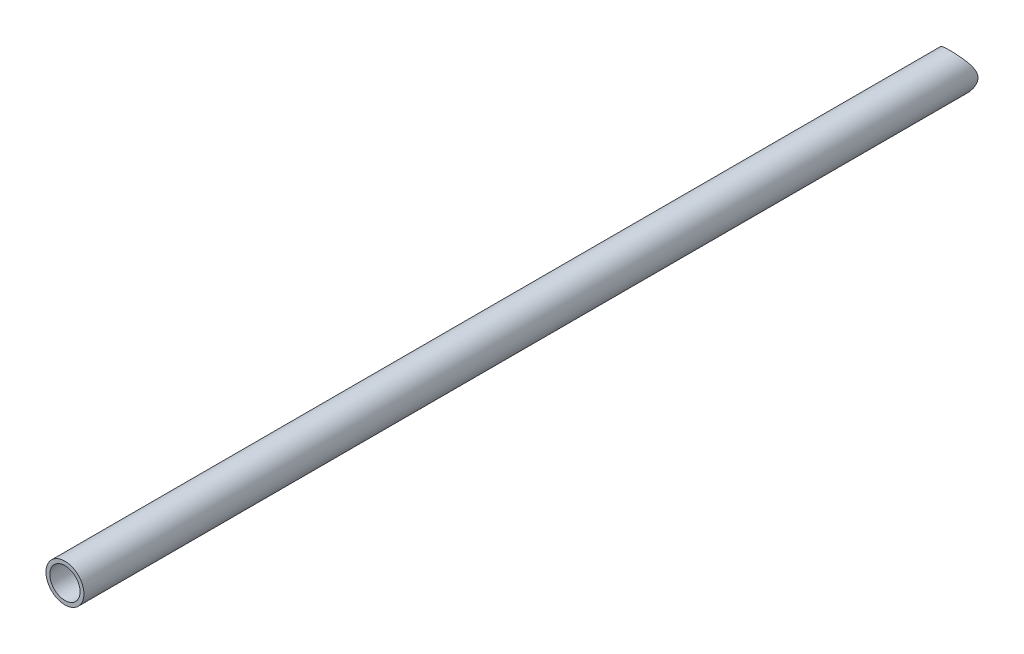
ISO-10303-21;
HEADER;
FILE_DESCRIPTION(('STEP AP214'),'2;1');
FILE_NAME('part.step','',(''),(''),'','','');
FILE_SCHEMA(('AUTOMOTIVE_DESIGN { 1 0 10303 214 1 1 1 1 }'));
ENDSEC;
DATA;
#1=APPLICATION_CONTEXT('core data for automotive mechanical design processes');
#2=APPLICATION_PROTOCOL_DEFINITION('international standard','automotive_design',2000,#1);
#3=PRODUCT_CONTEXT('',#1,'mechanical');
#4=PRODUCT('Part','Part','',(#3));
#5=PRODUCT_RELATED_PRODUCT_CATEGORY('part','',(#4));
#6=PRODUCT_DEFINITION_FORMATION('','',#4);
#7=PRODUCT_DEFINITION_CONTEXT('part definition',#1,'design');
#8=PRODUCT_DEFINITION('design','',#6,#7);
#9=PRODUCT_DEFINITION_SHAPE('','',#8);
#10=(LENGTH_UNIT() NAMED_UNIT(*) SI_UNIT(.MILLI.,.METRE.));
#11=(NAMED_UNIT(*) PLANE_ANGLE_UNIT() SI_UNIT($,.RADIAN.));
#12=(NAMED_UNIT(*) SI_UNIT($,.STERADIAN.) SOLID_ANGLE_UNIT());
#13=UNCERTAINTY_MEASURE_WITH_UNIT(LENGTH_MEASURE(1.E-05),#10,'distance_accuracy_value','');
#14=(GEOMETRIC_REPRESENTATION_CONTEXT(3) GLOBAL_UNCERTAINTY_ASSIGNED_CONTEXT((#13)) GLOBAL_UNIT_ASSIGNED_CONTEXT((#10,
#11,#12)) REPRESENTATION_CONTEXT('',''));
#15=CARTESIAN_POINT('',(0.,0.,0.));
#16=DIRECTION('',(0.,0.,1.));
#17=DIRECTION('',(1.,0.,0.));
#18=AXIS2_PLACEMENT_3D('',#15,#16,#17);
#19=CARTESIAN_POINT('',(0.,15.24,0.));
#20=DIRECTION('',(0.,-1.,0.));
#21=DIRECTION('',(0.,0.,-1.));
#22=AXIS2_PLACEMENT_3D('',#19,#20,#21);
#23=CYLINDRICAL_SURFACE('',#22,21.082);
#24=CARTESIAN_POINT('',(16.7005,0.,12.8663912481317));
#25=CARTESIAN_POINT('',(16.700501651617,-0.318048689825933,12.8663873917433));
#26=CARTESIAN_POINT('',(16.6913959959469,-0.636078058233101,12.878233728294));
#27=CARTESIAN_POINT('',(16.6552091317132,-1.26936872938503,12.9249990641684));
#28=CARTESIAN_POINT('',(16.6281288319816,-1.58463017126487,12.9599168969529));
#29=CARTESIAN_POINT('',(16.556552223082,-2.21059640241425,13.0512314661233));
#30=CARTESIAN_POINT('',(16.5120227972951,-2.52129135473047,13.1076690392102));
#31=CARTESIAN_POINT('',(16.406435560555,-3.13573086215765,13.2395887943427));
#32=CARTESIAN_POINT('',(16.3453749130287,-3.43947421474206,13.3150742446402));
#33=CARTESIAN_POINT('',(16.1842492768174,-4.14084876098796,13.5108048361985));
#34=CARTESIAN_POINT('',(16.077982364405,-4.53524728481028,13.6375397082877));
#35=CARTESIAN_POINT('',(15.8396836474816,-5.30799392340751,13.9136035044063));
#36=CARTESIAN_POINT('',(15.7076417804045,-5.68633569915751,14.0629412474859));
#37=CARTESIAN_POINT('',(15.4192499567052,-6.42743384951334,14.3785690320073));
#38=CARTESIAN_POINT('',(15.2628423194377,-6.79015056507849,14.5448989685858));
#39=CARTESIAN_POINT('',(14.9272840463478,-7.49911362250995,14.8890808174978));
#40=CARTESIAN_POINT('',(14.7481336137038,-7.84536011147893,15.066932626891));
#41=CARTESIAN_POINT('',(14.3024041651075,-8.63829840289962,15.4924732494015));
#42=CARTESIAN_POINT('',(14.0269775406112,-9.07846296782939,15.743098898961));
#43=CARTESIAN_POINT('',(13.4378225813671,-9.92973408775898,16.2488946386916));
#44=CARTESIAN_POINT('',(13.1240811814276,-10.3408306548058,16.5040662535432));
#45=CARTESIAN_POINT('',(12.4592472119749,-11.1328767461881,17.01154509946));
#46=CARTESIAN_POINT('',(12.1081844373139,-11.5138499015276,17.2638544400926));
#47=CARTESIAN_POINT('',(11.3689722747507,-12.2443047785302,17.7593665534507));
#48=CARTESIAN_POINT('',(10.9808349094774,-12.5937966380637,18.0025722429587));
#49=CARTESIAN_POINT('',(10.246856978174,-13.1942295023333,18.4281327972869));
#50=CARTESIAN_POINT('',(9.90742040228808,-13.4511353391158,18.6131389279361));
#51=CARTESIAN_POINT('',(9.2052426848626,-13.9410699521921,18.9702218281539));
#52=CARTESIAN_POINT('',(8.84250262469103,-14.1740998351184,19.1422991968622));
#53=CARTESIAN_POINT('',(8.09505502437904,-14.6138480285565,19.4701604131554));
#54=CARTESIAN_POINT('',(7.7103755682354,-14.8205989295075,19.6259643988977));
#55=CARTESIAN_POINT('',(6.92003928515724,-15.2056855933979,19.9183633517524));
#56=CARTESIAN_POINT('',(6.51438587820195,-15.3840259696791,20.0549614371226));
#57=CARTESIAN_POINT('',(5.75026126756025,-15.683807125484,20.2859119874366));
#58=CARTESIAN_POINT('',(5.39455250044627,-15.8097863364325,20.3835280358246));
#59=CARTESIAN_POINT('',(4.67143177476956,-16.0383338840936,20.5612989461302));
#60=CARTESIAN_POINT('',(4.30402100750051,-16.1409045952257,20.6414555789898));
#61=CARTESIAN_POINT('',(3.55969655452295,-16.3212078930991,20.7827504146704));
#62=CARTESIAN_POINT('',(3.18278649496967,-16.3989498072969,20.8438957592501));
#63=CARTESIAN_POINT('',(2.4218032502431,-16.5284760682203,20.9459531252307));
#64=CARTESIAN_POINT('',(2.0377299788854,-16.5802601024235,20.9868649030276));
#65=CARTESIAN_POINT('',(1.26394853613976,-16.6571543818868,21.0476663371774));
#66=CARTESIAN_POINT('',(0.874225795711741,-16.6821746677361,21.0674850936837));
#67=CARTESIAN_POINT('',(0.0934815880961315,-16.7048039829193,21.0854085011731));
#68=CARTESIAN_POINT('',(-0.297539881527446,-16.7024129608096,21.0835131114047));
#69=CARTESIAN_POINT('',(-1.07775822907055,-16.670260832553,21.0580513010129));
#70=CARTESIAN_POINT('',(-1.46695501820661,-16.6404984082069,21.0344838366684));
#71=CARTESIAN_POINT('',(-2.24046061871697,-16.5541076339679,20.9662062207014));
#72=CARTESIAN_POINT('',(-2.62476953138165,-16.4974798417346,20.9214965079407));
#73=CARTESIAN_POINT('',(-3.36595716497834,-16.3618931457417,20.8147525142177));
#74=CARTESIAN_POINT('',(-3.72322478696742,-16.2842447345686,20.7537370105179));
#75=CARTESIAN_POINT('',(-4.42876565574087,-16.1066776484362,20.6147044373035));
#76=CARTESIAN_POINT('',(-4.77703928705759,-16.006759927352,20.5366880959994));
#77=CARTESIAN_POINT('',(-5.46288298696909,-15.7858617455712,20.3649853151274));
#78=CARTESIAN_POINT('',(-5.80045212790357,-15.6648794652666,20.2712975218488));
#79=CARTESIAN_POINT('',(-6.46349157949888,-15.4031504972252,20.0697309820339));
#80=CARTESIAN_POINT('',(-6.78896023061739,-15.2624011110486,19.9618502981304));
#81=CARTESIAN_POINT('',(-7.45803660736237,-14.9477144408192,19.7222407688445));
#82=CARTESIAN_POINT('',(-7.80028273182769,-14.771874867815,19.5892101053885));
#83=CARTESIAN_POINT('',(-8.46779474930284,-14.3996258832921,19.3100514694989));
#84=CARTESIAN_POINT('',(-8.79305971576124,-14.2032153511039,19.1639227835708));
#85=CARTESIAN_POINT('',(-9.42603574881757,-13.791272704257,18.8606410730861));
#86=CARTESIAN_POINT('',(-9.73373976511962,-13.5757329972033,18.7034836764455));
#87=CARTESIAN_POINT('',(-10.3310355839786,-13.1269183916845,18.3803090933934));
#88=CARTESIAN_POINT('',(-10.6206253345675,-12.8936414905733,18.2142909071728));
#89=CARTESIAN_POINT('',(-11.2389465364587,-12.360896534547,17.8407575035741));
#90=CARTESIAN_POINT('',(-11.5635215076674,-12.0576666498107,17.631715822124));
#91=CARTESIAN_POINT('',(-12.1856888122493,-11.4285380286701,17.2075996876857));
#92=CARTESIAN_POINT('',(-12.483276565549,-11.1026354609468,16.9925242187667));
#93=CARTESIAN_POINT('',(-13.0514882835474,-10.4287970356688,16.5601013148656));
#94=CARTESIAN_POINT('',(-13.3220829665062,-10.0808379062256,16.3427516892293));
#95=CARTESIAN_POINT('',(-13.8355433882297,-9.36370199013698,15.9104067113895));
#96=CARTESIAN_POINT('',(-14.0784128552644,-8.99452806635241,15.6954110461675));
#97=CARTESIAN_POINT('',(-14.5090787381799,-8.27929045136326,15.2974838615841));
#98=CARTESIAN_POINT('',(-14.6999945759619,-7.93555716771786,15.1137383531768));
#99=CARTESIAN_POINT('',(-15.0589359152759,-7.23127694571284,14.7561286042124));
#100=CARTESIAN_POINT('',(-15.2269593605258,-6.87072850085055,14.5822652521248));
#101=CARTESIAN_POINT('',(-15.5386367295555,-6.13330543738905,14.2496787227652));
#102=CARTESIAN_POINT('',(-15.6823324945151,-5.75646027869631,14.0909297604156));
#103=CARTESIAN_POINT('',(-15.944006998122,-4.9860464783198,13.7941477236687));
#104=CARTESIAN_POINT('',(-16.0619965058618,-4.59248492250696,13.6561059819979));
#105=CARTESIAN_POINT('',(-16.2405793140075,-3.90364687412951,13.4427608518797));
#106=CARTESIAN_POINT('',(-16.307957215658,-3.61219218652713,13.3607726231799));
#107=CARTESIAN_POINT('',(-16.4275469470861,-3.02208006034199,13.2134566832712));
#108=CARTESIAN_POINT('',(-16.4797635271719,-2.72342490962226,13.1481237544489));
#109=CARTESIAN_POINT('',(-16.5680987875878,-2.12070532915108,13.0366369347095));
#110=CARTESIAN_POINT('',(-16.604244860437,-1.81665102975389,12.9904504174862));
#111=CARTESIAN_POINT('',(-16.6598377177618,-1.20454264699297,12.9190788389297));
#112=CARTESIAN_POINT('',(-16.6792847988268,-0.896488634766445,12.8938934045981));
#113=CARTESIAN_POINT('',(-16.7010868754288,-0.277219204190502,12.8656423640751));
#114=CARTESIAN_POINT('',(-16.7033569139518,0.0340043141999877,12.862686705965));
#115=CARTESIAN_POINT('',(-16.6905260764593,0.655473620640899,12.8793309880759));
#116=CARTESIAN_POINT('',(-16.6754253802914,0.965719418780784,12.8989306947701));
#117=CARTESIAN_POINT('',(-16.6281800817812,1.5831360912126,12.9597769137203));
#118=CARTESIAN_POINT('',(-16.596014116721,1.89030261864608,13.0010505572745));
#119=CARTESIAN_POINT('',(-16.515310333516,2.49911581309073,13.1034143704594));
#120=CARTESIAN_POINT('',(-16.4667700170888,2.8007616303827,13.1645075639618));
#121=CARTESIAN_POINT('',(-16.3387002130721,3.47895656814934,13.3233127026583));
#122=CARTESIAN_POINT('',(-16.2543206410225,3.85331486677387,13.4264738735132));
#123=CARTESIAN_POINT('',(-16.0622126684386,4.5887509913602,13.6557079223735));
#124=CARTESIAN_POINT('',(-15.9544766542316,4.94982444176101,13.7817882693433));
#125=CARTESIAN_POINT('',(-15.7170466761651,5.65872926612365,14.0519593402889));
#126=CARTESIAN_POINT('',(-15.5873007902475,6.00652688857553,14.1960924359324));
#127=CARTESIAN_POINT('',(-15.3073659836329,6.68781696743424,14.4975037303306));
#128=CARTESIAN_POINT('',(-15.1571762718318,7.02130886960294,14.6547824376832));
#129=CARTESIAN_POINT('',(-14.7692272097316,7.81315039908071,15.0474488039445));
#130=CARTESIAN_POINT('',(-14.5214022213876,8.26423493376886,15.2875918215807));
#131=CARTESIAN_POINT('',(-13.9879350069465,9.1381928231956,15.7771886692278));
#132=CARTESIAN_POINT('',(-13.7022784892393,9.56105542529523,16.0266459922018));
#133=CARTESIAN_POINT('',(-13.0938498051449,10.3787116126544,16.5274690255778));
#134=CARTESIAN_POINT('',(-12.7710445709027,10.7734796758603,16.7788362472858));
#135=CARTESIAN_POINT('',(-12.0890683367024,11.5335054910505,17.2766725909176));
#136=CARTESIAN_POINT('',(-11.7299026813521,11.8987675659614,17.523142426354));
#137=CARTESIAN_POINT('',(-10.9715181600409,12.601687953773,18.0078075980411));
#138=CARTESIAN_POINT('',(-10.5719158223075,12.9390134279921,18.2458878375064));
#139=CARTESIAN_POINT('',(-9.73647589874634,13.5788301252783,18.7050542579474));
#140=CARTESIAN_POINT('',(-9.3006328827464,13.8813161118687,18.9261378826259));
#141=CARTESIAN_POINT('',(-8.39513210989653,14.4468801952228,19.344775363046));
#142=CARTESIAN_POINT('',(-7.9255716356719,14.7100654137341,19.542392867089));
#143=CARTESIAN_POINT('',(-7.19731935840765,15.0724532868862,19.8170813368229));
#144=CARTESIAN_POINT('',(-6.95062350463153,15.1878355139333,19.9050092277108));
#145=CARTESIAN_POINT('',(-6.44953596791651,15.4073034317559,20.0729674857473));
#146=CARTESIAN_POINT('',(-6.19514252203694,15.5113865093176,20.1529960255847));
#147=CARTESIAN_POINT('',(-5.58850270960066,15.742123762028,20.3310441859218));
#148=CARTESIAN_POINT('',(-5.23330546142895,15.8638435230263,20.4254935692793));
#149=CARTESIAN_POINT('',(-4.51172820359067,16.0839438789019,20.5969053717735));
#150=CARTESIAN_POINT('',(-4.14535110562109,16.1823304931231,20.6738723007111));
#151=CARTESIAN_POINT('',(-3.40359803049756,16.3544205439274,20.8088501637051));
#152=CARTESIAN_POINT('',(-3.02822692471347,16.4281370324666,20.8668711209056));
#153=CARTESIAN_POINT('',(-2.27076954163596,16.5498471001216,20.9628256560164));
#154=CARTESIAN_POINT('',(-1.88868301177858,16.5978397096271,21.0007584767437));
#155=CARTESIAN_POINT('',(-1.11938289881167,16.6674326009731,21.0558038754408));
#156=CARTESIAN_POINT('',(-0.732156901736672,16.6889487293993,21.0728500661707));
#157=CARTESIAN_POINT('',(0.043204504981922,16.7049451075738,21.0855208771548));
#158=CARTESIAN_POINT('',(0.431339910592508,16.6994254769932,21.0811455922291));
#159=CARTESIAN_POINT('',(1.20549610108005,16.6614433499555,21.0510708685619));
#160=CARTESIAN_POINT('',(1.59151663713242,16.628977748906,21.0253689726652));
#161=CARTESIAN_POINT('',(2.35843983195101,16.5376416882991,20.953205799383));
#162=CARTESIAN_POINT('',(2.7393425623507,16.4787715987203,20.906744812873));
#163=CARTESIAN_POINT('',(3.47653064006858,16.3387543610254,20.796565615652));
#164=CARTESIAN_POINT('',(3.83315703418039,16.258715546456,20.7337076877095));
#165=CARTESIAN_POINT('',(4.53720988902331,16.0764627980447,20.5911014899583));
#166=CARTESIAN_POINT('',(4.88463669251061,15.9742496916755,20.5113538504213));
#167=CARTESIAN_POINT('',(5.56861372568991,15.748870531723,20.3363199108091));
#168=CARTESIAN_POINT('',(5.90516299606031,15.625702636043,20.2410322446695));
#169=CARTESIAN_POINT('',(6.56602190545001,15.3597189063707,20.0364111096677));
#170=CARTESIAN_POINT('',(6.89032985410818,15.2169003714472,19.9270757101167));
#171=CARTESIAN_POINT('',(7.55805330288437,14.8974204202017,19.6841387193259));
#172=CARTESIAN_POINT('',(7.90004062352913,14.7187926095879,19.5491993753862));
#173=CARTESIAN_POINT('',(8.56681616378846,14.340963558524,19.2663326131071));
#174=CARTESIAN_POINT('',(8.89160340183399,14.1417611458385,19.1184044548038));
#175=CARTESIAN_POINT('',(9.52343973795521,13.7242214709157,18.811650675443));
#176=CARTESIAN_POINT('',(9.83048093371337,13.505875791456,18.6528202674384));
#177=CARTESIAN_POINT('',(10.4262683905535,13.0514378494232,18.3264577517432));
#178=CARTESIAN_POINT('',(10.7150125873043,12.8153435909403,18.1589246660528));
#179=CARTESIAN_POINT('',(11.3317154951496,12.2759791897521,17.7819885897027));
#180=CARTESIAN_POINT('',(11.655444297994,11.9689105074742,17.571088575294));
#181=CARTESIAN_POINT('',(12.2756087170259,11.3319800895008,17.1435711177535));
#182=CARTESIAN_POINT('',(12.5720396115871,11.0021144278967,16.9269526938337));
#183=CARTESIAN_POINT('',(13.1375681650508,10.3202416604379,16.4918887587687));
#184=CARTESIAN_POINT('',(13.4066407690612,9.96821472836109,16.2734417676381));
#185=CARTESIAN_POINT('',(13.9167145117196,9.24274717376761,15.8394396391555));
#186=CARTESIAN_POINT('',(14.1577195765203,8.86930955715948,15.6238841010818));
#187=CARTESIAN_POINT('',(14.5805077214523,8.15257906502349,15.2292990917825));
#188=CARTESIAN_POINT('',(14.7658974121463,7.81197346508016,15.0492520992012));
#189=CARTESIAN_POINT('',(15.1143396634912,7.11445388079238,14.6992659871256));
#190=CARTESIAN_POINT('',(15.2773913017285,6.75753922380284,14.5293272852008));
#191=CARTESIAN_POINT('',(15.5798166584451,6.027589569912,14.2045484195266));
#192=CARTESIAN_POINT('',(15.7192178426184,5.65457391200252,14.0496908321221));
#193=CARTESIAN_POINT('',(15.9094287389788,5.0830179858338,13.8329343723868));
#194=CARTESIAN_POINT('',(15.9696792325822,4.89051213912476,13.7632762144976));
#195=CARTESIAN_POINT('',(16.0836734203298,4.5014729928723,13.6298886210665));
#196=CARTESIAN_POINT('',(16.1374148076491,4.30493829418982,13.56616128925));
#197=CARTESIAN_POINT('',(16.2706777095569,3.77960581377658,13.4064365606402));
#198=CARTESIAN_POINT('',(16.3443814845616,3.44750739154091,13.3162382454226));
#199=CARTESIAN_POINT('',(16.4719937124611,2.77441513902288,13.158059006875));
#200=CARTESIAN_POINT('',(16.525909838509,2.43342481185327,13.0900694726647));
#201=CARTESIAN_POINT('',(16.6126379552029,1.74550473979612,12.9798278410167));
#202=CARTESIAN_POINT('',(16.6455042769087,1.39859267761828,12.9375094994427));
#203=CARTESIAN_POINT('',(16.6894329539482,0.701112261556148,12.8807951660989));
#204=CARTESIAN_POINT('',(16.7004981796338,0.3505443951091,12.8663954985354));
#205=CARTESIAN_POINT('',(16.7005,0.,12.8663912481317));
#206=B_SPLINE_CURVE_WITH_KNOTS('',3,(#24,#25,#26,#27,#28,#29,#30,#31,#32,#33,#34,#35,#36,#37,
#38,#39,#40,#41,#42,#43,#44,#45,#46,#47,#48,#49,#50,#51,#52,#53,#54,#55,#56,#57,#58,#59,#60,#61,
#62,#63,#64,#65,#66,#67,#68,#69,#70,#71,#72,#73,#74,#75,#76,#77,#78,#79,#80,#81,#82,#83,#84,#85,
#86,#87,#88,#89,#90,#91,#92,#93,#94,#95,#96,#97,#98,#99,#100,#101,#102,#103,#104,#105,#106,#107,
#108,#109,#110,#111,#112,#113,#114,#115,#116,#117,#118,#119,#120,#121,#122,#123,#124,#125,#126,
#127,#128,#129,#130,#131,#132,#133,#134,#135,#136,#137,#138,#139,#140,#141,#142,#143,#144,#145,
#146,#147,#148,#149,#150,#151,#152,#153,#154,#155,#156,#157,#158,#159,#160,#161,#162,#163,#164,
#165,#166,#167,#168,#169,#170,#171,#172,#173,#174,#175,#176,#177,#178,#179,#180,#181,#182,#183,
#184,#185,#186,#187,#188,#189,#190,#191,#192,#193,#194,#195,#196,#197,#198,#199,#200,#201,#202,
#203,#204,#205),.UNSPECIFIED.,.T.,.F.,(4,2,2,2,2,2,2,2,2,2,2,2,2,2,2,2,2,2,2,2,2,2,2,2,2,2,2,2,
2,2,2,2,2,2,2,2,2,2,2,2,2,2,2,2,2,2,2,2,2,2,2,2,2,2,2,2,2,2,2,2,2,2,2,2,2,2,2,2,2,2,2,2,2,2,2,2,
2,2,2,2,2,2,2,2,2,2,2,2,2,2,4),(0.,0.953770253152086,1.90749228554254,2.86303321846626,
3.81873821557278,5.09973719424736,6.38123727992338,7.66581847596868,8.95038819671196,
10.6778456227999,12.4058937587299,14.1325725533414,15.8586933055416,17.2499206328614,
18.641083448647,20.0305037918119,21.4196982884253,22.5878567174351,23.7558966026555,
24.9234971717229,26.0911117978878,27.2626388435819,28.4341680879188,29.605753755739,
30.7773151053589,31.8881150056962,32.9988673355988,34.109715662636,35.2207157810526,
36.4409200480069,37.6611908241429,38.8819481120533,40.1028434367691,41.5741835920006,
43.0457729868519,44.518941768889,45.9919122167757,47.2929955951988,48.5941957649571,
49.8931347502231,51.1915285216623,52.121264909013,53.0507096785082,53.9785640583686,
54.9064019583445,55.8388259291543,56.7712402462134,57.704824545832,58.6385513495939,
59.8288195609721,61.0194763578914,62.2129820427783,63.4065339252722,65.1080417072819,
66.8101941109068,68.5138735758949,70.2173029801395,71.9387500756245,73.6604555729235,
75.3773790394318,76.2355742662208,77.093967551391,78.2542294880903,79.4141917810572,
80.5735394115764,81.7329307383196,82.8959976596561,84.0590594327964,85.2222552272382,
86.3854347235396,87.4968346849218,88.6081931795964,89.7196494222657,90.831258584705,
92.0563239031349,93.2814590580459,94.507135628079,95.732950237894,97.2121251934925,
98.6915555182791,100.172328736786,101.652894571865,102.934615973831,104.216390286468,
105.496665708338,106.136686065598,106.776932586249,107.831431092887,108.885520258368,
109.936877661342,110.988096632398),.UNSPECIFIED.);
#207=CARTESIAN_POINT('',(16.7005,0.,12.8663912481317));
#208=VERTEX_POINT('',#207);
#209=EDGE_CURVE('E28',#208,#208,#206,.F.);
#210=ORIENTED_EDGE('',*,*,#209,.F.);
#211=EDGE_LOOP('',(#210));
#212=FACE_BOUND('',#211,.T.);
#213=CARTESIAN_POINT('',(13.3223,0.,16.3391262529549));
#214=CARTESIAN_POINT('',(13.3222973717481,0.330253881623365,16.3391305113551));
#215=CARTESIAN_POINT('',(13.3099961281945,0.660550496552831,16.349182095578));
#216=CARTESIAN_POINT('',(13.261020887059,1.31827845434102,16.3889294983763));
#217=CARTESIAN_POINT('',(13.2243335813186,1.64570813372475,16.4186360431746));
#218=CARTESIAN_POINT('',(13.1271643400441,2.29551845533996,16.4964281863531));
#219=CARTESIAN_POINT('',(13.0666301363894,2.61788637815018,16.5445541501573));
#220=CARTESIAN_POINT('',(12.9227855057099,3.25450527586383,16.6571501824458));
#221=CARTESIAN_POINT('',(12.8394771041408,3.56875696987667,16.7216187974362));
#222=CARTESIAN_POINT('',(12.6520943413218,4.18459731586657,16.8638346430613));
#223=CARTESIAN_POINT('',(12.5482159158166,4.48627519913903,16.9414556563588));
#224=CARTESIAN_POINT('',(12.3203000151306,5.07885023591911,17.1079174860316));
#225=CARTESIAN_POINT('',(12.1962532745089,5.36974235859694,17.1967634550145));
#226=CARTESIAN_POINT('',(11.9290932455769,5.93965039457839,17.3831519770642));
#227=CARTESIAN_POINT('',(11.7859829931264,6.21866818955002,17.4806931446061));
#228=CARTESIAN_POINT('',(11.481637779657,6.76411012392335,17.6820814839532));
#229=CARTESIAN_POINT('',(11.3204081542284,7.03053793802656,17.7859267952646));
#230=CARTESIAN_POINT('',(10.9571281738933,7.58616194070119,18.0123277424432));
#231=CARTESIAN_POINT('',(10.7525142186693,7.87343740095406,18.1354899438302));
#232=CARTESIAN_POINT('',(10.3217169704323,8.43028882804763,18.384089404668));
#233=CARTESIAN_POINT('',(10.0955322923297,8.69986365642406,18.5095268097937));
#234=CARTESIAN_POINT('',(9.62221873631673,9.2206554096145,18.7599404577919));
#235=CARTESIAN_POINT('',(9.37507269773629,9.47185697308972,18.8849162336713));
#236=CARTESIAN_POINT('',(8.86077036898423,9.95463876872877,19.1316186379998));
#237=CARTESIAN_POINT('',(8.59361290298251,10.1862178462094,19.2533450749536));
#238=CARTESIAN_POINT('',(8.00558915240871,10.6561223251609,19.5057930306199));
#239=CARTESIAN_POINT('',(7.68217863907029,10.8916921150564,19.6357451367064));
#240=CARTESIAN_POINT('',(7.01245706661648,11.3344724356489,19.8847631783018));
#241=CARTESIAN_POINT('',(6.66614362307132,11.5416800066328,20.0038279772462));
#242=CARTESIAN_POINT('',(5.9527493541643,11.9252807980772,20.2275830861002));
#243=CARTESIAN_POINT('',(5.58568462406122,12.1016974781864,20.3322843265063));
#244=CARTESIAN_POINT('',(4.8330397118537,12.4214526539662,20.5242093954112));
#245=CARTESIAN_POINT('',(4.44746300747042,12.5647973335051,20.611436490858));
#246=CARTESIAN_POINT('',(3.70165664102302,12.8030636977902,20.7575911825946));
#247=CARTESIAN_POINT('',(3.34292621858888,12.9014589498764,20.8185119205681));
#248=CARTESIAN_POINT('',(2.61597828981689,13.0682573794544,20.922287701235));
#249=CARTESIAN_POINT('',(2.24776137840827,13.1366624329071,20.965143873905));
#250=CARTESIAN_POINT('',(1.50548532903385,13.2422656806345,21.0314754574074));
#251=CARTESIAN_POINT('',(1.13143177554687,13.2794920404835,21.0549683599309));
#252=CARTESIAN_POINT('',(0.380812581577307,13.3221587762608,21.0819040087995));
#253=CARTESIAN_POINT('',(0.00424724559359096,13.3276029374136,21.0853491428113));
#254=CARTESIAN_POINT('',(-0.695953330883628,13.3080667032046,21.0730079641703));
#255=CARTESIAN_POINT('',(-1.01975773112995,13.2871606260734,21.0597969665453));
#256=CARTESIAN_POINT('',(-1.6640271547936,13.2219323016746,21.0187034189637));
#257=CARTESIAN_POINT('',(-1.98449255806734,13.1776127483349,20.9908225569065));
#258=CARTESIAN_POINT('',(-2.61986861945919,13.0661401715609,20.9210224772911));
#259=CARTESIAN_POINT('',(-2.93477905025662,12.9989862159664,20.879102686628));
#260=CARTESIAN_POINT('',(-3.55702117965746,12.8426708310539,20.7821434034276));
#261=CARTESIAN_POINT('',(-3.86435255683611,12.7535084701271,20.7271033555174));
#262=CARTESIAN_POINT('',(-4.47010525139357,12.5540303761235,20.6049630008588));
#263=CARTESIAN_POINT('',(-4.76851279811625,12.4436837216218,20.5378450738502));
#264=CARTESIAN_POINT('',(-5.35445531816933,12.2030244901552,20.3929307863315));
#265=CARTESIAN_POINT('',(-5.64199043344914,12.0727121739725,20.3151345652977));
#266=CARTESIAN_POINT('',(-6.20499873197544,11.7932375638431,20.1503043147906));
#267=CARTESIAN_POINT('',(-6.48047116763028,11.6440741038058,20.0632697139046));
#268=CARTESIAN_POINT('',(-7.01838905820144,11.3279846147506,19.8814879973311));
#269=CARTESIAN_POINT('',(-7.28083286006883,11.1610563401698,19.7867399069758));
#270=CARTESIAN_POINT('',(-7.82402051780338,10.7884227095782,19.5788221949826));
#271=CARTESIAN_POINT('',(-8.10291822229494,10.580480604745,19.4648340222658));
#272=CARTESIAN_POINT('',(-8.642281884576,10.1446968985864,19.2314341360974));
#273=CARTESIAN_POINT('',(-8.90274651975536,9.9168538719449,19.112022034475));
#274=CARTESIAN_POINT('',(-9.40481807785471,9.44206623984525,18.8700260229549));
#275=CARTESIAN_POINT('',(-9.64639823579941,9.19509547671532,18.7474379277805));
#276=CARTESIAN_POINT('',(-10.1095640594373,8.68328987964414,18.5017882358613));
#277=CARTESIAN_POINT('',(-10.3311491025474,8.41845448990476,18.3787266244971));
#278=CARTESIAN_POINT('',(-10.7820537906732,7.83483883885309,18.1183504461813));
#279=CARTESIAN_POINT('',(-11.0083863744818,7.51360023651344,17.9813519228855));
#280=CARTESIAN_POINT('',(-11.4330050231,6.85019666069528,17.7144020006276));
#281=CARTESIAN_POINT('',(-11.6312856371546,6.50802763869479,17.5844519742697));
#282=CARTESIAN_POINT('',(-11.9978397163246,5.80453279938044,17.3364204533618));
#283=CARTESIAN_POINT('',(-12.1661572917089,5.44323617548838,17.2183216257222));
#284=CARTESIAN_POINT('',(-12.4711035516601,4.70270327945174,16.9987541421137));
#285=CARTESIAN_POINT('',(-12.6077460262137,4.32347490093128,16.897278254892));
#286=CARTESIAN_POINT('',(-12.8151602163798,3.65287893202664,16.7402059812209));
#287=CARTESIAN_POINT('',(-12.8937779964249,3.36509253500296,16.6795942604565));
#288=CARTESIAN_POINT('',(-13.0319163792628,2.78251515616832,16.5718909269208));
#289=CARTESIAN_POINT('',(-13.0914417269568,2.48772593430864,16.5247959552382));
#290=CARTESIAN_POINT('',(-13.1905419689764,1.89314638830654,16.4458004751291));
#291=CARTESIAN_POINT('',(-13.2301403095771,1.59336237237018,16.4138821122348));
#292=CARTESIAN_POINT('',(-13.2888796297897,0.990489522629274,16.3663631201045));
#293=CARTESIAN_POINT('',(-13.3080203209502,0.687400642287252,16.3507627209507));
#294=CARTESIAN_POINT('',(-13.3255427481005,0.0794292046658526,16.3364857755747));
#295=CARTESIAN_POINT('',(-13.3238703301547,-0.225455967825701,16.3378533786196));
#296=CARTESIAN_POINT('',(-13.2996644238364,-0.833839252179936,16.3575636281253));
#297=CARTESIAN_POINT('',(-13.2771308188781,-1.13733735628125,16.3759063694541));
#298=CARTESIAN_POINT('',(-13.2115570302107,-1.74087828175401,16.4288541389662));
#299=CARTESIAN_POINT('',(-13.1685020898881,-2.04091845731199,16.4634708693089));
#300=CARTESIAN_POINT('',(-13.0625392046902,-2.63531739678234,16.5476691990959));
#301=CARTESIAN_POINT('',(-12.9996307901187,-2.92967602610507,16.5972511525885));
#302=CARTESIAN_POINT('',(-12.8563674996272,-3.50477054801577,16.708457865368));
#303=CARTESIAN_POINT('',(-12.7764190650625,-3.78566336682472,16.769799193168));
#304=CARTESIAN_POINT('',(-12.599144751548,-4.33932710489836,16.9033898003629));
#305=CARTESIAN_POINT('',(-12.5018132167355,-4.61209534690117,16.9756426287997));
#306=CARTESIAN_POINT('',(-12.2906234495404,-5.1485292903521,17.129166125216));
#307=CARTESIAN_POINT('',(-12.1767646284935,-5.41219466716258,17.2104371143776));
#308=CARTESIAN_POINT('',(-11.9332951230023,-5.92975084234433,17.3801384052939));
#309=CARTESIAN_POINT('',(-11.8036836780967,-6.18364116804321,17.4685690526138));
#310=CARTESIAN_POINT('',(-11.5029239437274,-6.72913362104269,17.6683906930287));
#311=CARTESIAN_POINT('',(-11.3285859790314,-7.01856379524919,17.7809203449786));
#312=CARTESIAN_POINT('',(-10.959491716677,-7.58199447449597,18.0107614907424));
#313=CARTESIAN_POINT('',(-10.7647381159814,-7.85599701023809,18.1280723516969));
#314=CARTESIAN_POINT('',(-10.3553924989958,-8.38822633444795,18.3649814922194));
#315=CARTESIAN_POINT('',(-10.1407797793224,-8.64643618242599,18.4845820534593));
#316=CARTESIAN_POINT('',(-9.69260666329293,-9.14601984195225,18.7234772646741));
#317=CARTESIAN_POINT('',(-9.45904502426639,-9.38739254738678,18.8427718940559));
#318=CARTESIAN_POINT('',(-8.93247035222634,-9.89187387143331,19.0987243868791));
#319=CARTESIAN_POINT('',(-8.63609098100279,-10.1517308450038,19.234897499177));
#320=CARTESIAN_POINT('',(-8.01943356194572,-10.6455817544551,19.5000531036435));
#321=CARTESIAN_POINT('',(-7.69915261010096,-10.8795725390295,19.6290347187176));
#322=CARTESIAN_POINT('',(-7.03614991169016,-11.3196519693036,19.8763289121538));
#323=CARTESIAN_POINT('',(-6.6934333920555,-11.5257470799232,19.9946439604002));
#324=CARTESIAN_POINT('',(-5.98730208059,-11.9078539460845,20.2173174924593));
#325=CARTESIAN_POINT('',(-5.62388981513476,-12.0838693630709,20.3216776745884));
#326=CARTESIAN_POINT('',(-4.899226559609,-12.3946769384233,20.5080586141684));
#327=CARTESIAN_POINT('',(-4.53895613158446,-12.5312039930199,20.5909923820404));
#328=CARTESIAN_POINT('',(-3.80460751477245,-12.7733342331777,20.7392367690485));
#329=CARTESIAN_POINT('',(-3.43052958569902,-12.8789380000613,20.8045477194715));
#330=CARTESIAN_POINT('',(-2.67223614812089,-13.0573485459357,20.9154612287121));
#331=CARTESIAN_POINT('',(-2.28803350627434,-13.1301950093474,20.961087631991));
#332=CARTESIAN_POINT('',(-1.51283764563681,-13.2419131292438,21.0312482701742));
#333=CARTESIAN_POINT('',(-1.12184563551018,-13.2807907709874,21.0557862208221));
#334=CARTESIAN_POINT('',(-0.396711691538377,-13.3205665215959,21.0809006282861));
#335=CARTESIAN_POINT('',(-0.0629310361469373,-13.3263261657489,21.0845440284207));
#336=CARTESIAN_POINT('',(0.603892370287251,-13.3127817398052,21.0759855798025));
#337=CARTESIAN_POINT('',(0.936935206188185,-13.2934807198318,21.0637856593339));
#338=CARTESIAN_POINT('',(1.59967832047806,-13.230099373803,21.0238430198419));
#339=CARTESIAN_POINT('',(1.92937879697243,-13.1860205252032,20.9961012275518));
#340=CARTESIAN_POINT('',(2.58301977612099,-13.0737008799784,20.925744570528));
#341=CARTESIAN_POINT('',(2.90696017744315,-13.0054596587264,20.8831294444121));
#342=CARTESIAN_POINT('',(3.53386928639768,-12.8489519971483,20.7860291959312));
#343=CARTESIAN_POINT('',(3.83715569177037,-12.7616100220899,20.7320956140383));
#344=CARTESIAN_POINT('',(4.43467632504637,-12.566467367348,20.6125496388271));
#345=CARTESIAN_POINT('',(4.72891094187535,-12.458667568101,20.5469377481115));
#346=CARTESIAN_POINT('',(5.30691428639416,-12.2236524436887,20.4052918371375));
#347=CARTESIAN_POINT('',(5.59068283343493,-12.0964367835916,20.329257637092));
#348=CARTESIAN_POINT('',(6.14660648832406,-11.8236541138625,20.1681365430703));
#349=CARTESIAN_POINT('',(6.41876015417129,-11.6780848344272,20.0830485296069));
#350=CARTESIAN_POINT('',(6.97755545223903,-11.3539453827574,19.8962265553368));
#351=CARTESIAN_POINT('',(7.26285204708207,-11.1735243285998,19.7936798166308));
#352=CARTESIAN_POINT('',(7.81715853589557,-10.7929954226036,19.5813906826041));
#353=CARTESIAN_POINT('',(8.08616751023945,-10.5928864608237,19.471647881709));
#354=CARTESIAN_POINT('',(8.60733769653511,-10.1739523255798,19.2469494584672));
#355=CARTESIAN_POINT('',(8.85948237209718,-9.95510924798698,19.1319888999408));
#356=CARTESIAN_POINT('',(9.34595773746046,-9.49988136061228,18.8991147708728));
#357=CARTESIAN_POINT('',(9.58028684869102,-9.26349500004427,18.7812009398804));
#358=CARTESIAN_POINT('',(10.0638774167511,-8.73772590423284,18.5271241624809));
#359=CARTESIAN_POINT('',(10.3101969577276,-8.44568350711926,18.390848998974));
#360=CARTESIAN_POINT('',(10.7774477235928,-7.84068966071554,18.1209865863357));
#361=CARTESIAN_POINT('',(10.9983743331024,-7.52773442663638,17.9873998294733));
#362=CARTESIAN_POINT('',(11.4135112883949,-6.88205710752821,17.7268869321681));
#363=CARTESIAN_POINT('',(11.6077287156062,-6.54934029553118,17.5999590317984));
#364=CARTESIAN_POINT('',(11.967965837925,-5.86522113550452,17.3570076889687));
#365=CARTESIAN_POINT('',(12.1339939917898,-5.51382443445758,17.2409809800713));
#366=CARTESIAN_POINT('',(12.4031995778466,-4.87212975921965,17.0479479990707));
#367=CARTESIAN_POINT('',(12.5121930623016,-4.58516421466632,16.9679433386877));
#368=CARTESIAN_POINT('',(12.7108493712909,-4.00161862602963,16.8196435297891));
#369=CARTESIAN_POINT('',(12.8005122135071,-3.70503859074107,16.7513483705628));
#370=CARTESIAN_POINT('',(12.9592584683353,-3.10443453914118,16.628842018274));
#371=CARTESIAN_POINT('',(13.0283966475015,-2.80043271872678,16.574593394836));
#372=CARTESIAN_POINT('',(13.1454307436763,-2.18609602587846,16.4819287412752));
#373=CARTESIAN_POINT('',(13.1933368860209,-1.87576427742486,16.4435050904874));
#374=CARTESIAN_POINT('',(13.2608099678365,-1.30476347587858,16.3891171893202));
#375=CARTESIAN_POINT('',(13.2838391329479,-1.04475813008215,16.370422643659));
#376=CARTESIAN_POINT('',(13.314587254822,-0.523177730246923,16.3454238178452));
#377=CARTESIAN_POINT('',(13.3223020819034,-0.261602271878031,16.3391228797707));
#378=CARTESIAN_POINT('',(13.3223,0.,16.3391262529549));
#379=B_SPLINE_CURVE_WITH_KNOTS('',3,(#213,#214,#215,#216,#217,#218,#219,#220,#221,#222,#223,
#224,#225,#226,#227,#228,#229,#230,#231,#232,#233,#234,#235,#236,#237,#238,#239,#240,#241,#242,
#243,#244,#245,#246,#247,#248,#249,#250,#251,#252,#253,#254,#255,#256,#257,#258,#259,#260,#261,
#262,#263,#264,#265,#266,#267,#268,#269,#270,#271,#272,#273,#274,#275,#276,#277,#278,#279,#280,
#281,#282,#283,#284,#285,#286,#287,#288,#289,#290,#291,#292,#293,#294,#295,#296,#297,#298,#299,
#300,#301,#302,#303,#304,#305,#306,#307,#308,#309,#310,#311,#312,#313,#314,#315,#316,#317,#318,
#319,#320,#321,#322,#323,#324,#325,#326,#327,#328,#329,#330,#331,#332,#333,#334,#335,#336,#337,
#338,#339,#340,#341,#342,#343,#344,#345,#346,#347,#348,#349,#350,#351,#352,#353,#354,#355,#356,
#357,#358,#359,#360,#361,#362,#363,#364,#365,#366,#367,#368,#369,#370,#371,#372,#373,#374,#375,
#376,#377,#378),.UNSPECIFIED.,.T.,.F.,(4,2,2,2,2,2,2,2,2,2,2,2,2,2,2,2,2,2,2,2,2,2,2,2,2,2,2,2,
2,2,2,2,2,2,2,2,2,2,2,2,2,2,2,2,2,2,2,2,2,2,2,2,2,2,2,2,2,2,2,2,2,2,2,2,2,2,2,2,2,2,2,2,2,2,2,2,
2,2,2,2,2,2,4),(0.,0.990460458177348,1.98146188268568,2.97464759884602,3.96774501334082,
4.95180226671976,5.93631288578716,6.92066690878483,7.90473182598746,9.02438253377106,
10.1441051845367,11.264753547153,12.3854678084805,13.6458428856741,14.906349388031,
16.1658912749993,17.4251974591086,18.5543444820933,19.683420864069,20.8114761804914,
21.9393971440408,22.9124679681093,23.8854268561334,24.8584254676602,25.8314652729675,
26.8059363149262,27.7803946298908,28.7549132522525,29.7295552053655,30.8267040812807,
31.9239316002058,33.0226870395687,34.1214766788142,35.3684519139404,36.6156691159803,
37.861034755611,39.105857193665,40.0182554590256,40.9304267967735,41.8415223422503,
42.7526307339387,43.666110246546,44.5795948643005,45.4937373497393,46.4079014637079,
47.3023084243094,48.1970069260917,49.0917373028284,49.9865108900347,51.0538743667211,
52.1210970189644,53.189445075867,54.2578632517723,55.5073993616508,56.7570875365042,
58.0064855940475,59.2557314603731,60.4362651671889,61.6167766799021,62.7958541622382,
63.9747238508455,64.9749963380365,65.9751470938696,66.9752382189068,67.9753469203119,
68.9348920805794,69.8943959545937,70.8539163823328,71.8135555911606,72.87087478162,
73.9282536145451,74.9866545100524,76.0451490774794,77.2606728509046,78.4764172078044,
79.6918386093638,80.9068946522806,81.8577006039631,82.8085056859268,83.7567504197719,
84.7045379819755,85.4888947383856,86.2734629765874),.UNSPECIFIED.);
#380=CARTESIAN_POINT('',(13.3223,0.,16.3391262529549));
#381=VERTEX_POINT('',#380);
#382=EDGE_CURVE('E9',#381,#381,#379,.F.);
#383=ORIENTED_EDGE('',*,*,#382,.F.);
#384=EDGE_LOOP('',(#383));
#385=FACE_BOUND('',#384,.T.);
#386=ADVANCED_FACE('F14',(#212,#385),#23,.F.);
#387=CARTESIAN_POINT('',(0.,0.,0.));
#388=DIRECTION('',(0.,0.,1.));
#389=DIRECTION('',(1.,0.,0.));
#390=AXIS2_PLACEMENT_3D('',#387,#388,#389);
#391=CYLINDRICAL_SURFACE('',#390,13.3223);
#392=ORIENTED_EDGE('',*,*,#382,.T.);
#393=EDGE_LOOP('',(#392));
#394=FACE_BOUND('',#393,.T.);
#395=CARTESIAN_POINT('',(0.,0.,800.1));
#396=DIRECTION('',(0.,0.,1.));
#397=DIRECTION('',(1.,0.,0.));
#398=AXIS2_PLACEMENT_3D('',#395,#396,#397);
#399=CIRCLE('',#398,13.3223);
#400=CARTESIAN_POINT('',(13.3223,0.,800.1));
#401=VERTEX_POINT('',#400);
#402=EDGE_CURVE('E23',#401,#401,#399,.T.);
#403=ORIENTED_EDGE('',*,*,#402,.T.);
#404=EDGE_LOOP('',(#403));
#405=FACE_BOUND('',#404,.T.);
#406=ADVANCED_FACE('F34',(#394,#405),#391,.F.);
#407=CARTESIAN_POINT('',(0.,0.,0.));
#408=DIRECTION('',(0.,0.,1.));
#409=DIRECTION('',(1.,0.,0.));
#410=AXIS2_PLACEMENT_3D('',#407,#408,#409);
#411=CYLINDRICAL_SURFACE('',#410,16.7005);
#412=ORIENTED_EDGE('',*,*,#209,.T.);
#413=EDGE_LOOP('',(#412));
#414=FACE_BOUND('',#413,.T.);
#415=CARTESIAN_POINT('',(0.,0.,800.1));
#416=DIRECTION('',(0.,0.,1.));
#417=DIRECTION('',(1.,0.,0.));
#418=AXIS2_PLACEMENT_3D('',#415,#416,#417);
#419=CIRCLE('',#418,16.7005);
#420=CARTESIAN_POINT('',(16.7005,0.,800.1));
#421=VERTEX_POINT('',#420);
#422=EDGE_CURVE('E19',#421,#421,#419,.F.);
#423=ORIENTED_EDGE('',*,*,#422,.T.);
#424=EDGE_LOOP('',(#423));
#425=FACE_BOUND('',#424,.T.);
#426=ADVANCED_FACE('F16',(#414,#425),#411,.T.);
#427=CARTESIAN_POINT('',(0.,0.,800.1));
#428=DIRECTION('',(0.,0.,1.));
#429=DIRECTION('',(1.,0.,0.));
#430=AXIS2_PLACEMENT_3D('',#427,#428,#429);
#431=PLANE('',#430);
#432=ORIENTED_EDGE('',*,*,#422,.F.);
#433=EDGE_LOOP('',(#432));
#434=FACE_BOUND('',#433,.T.);
#435=ORIENTED_EDGE('',*,*,#402,.F.);
#436=EDGE_LOOP('',(#435));
#437=FACE_BOUND('',#436,.T.);
#438=ADVANCED_FACE('F38',(#434,#437),#431,.T.);
#439=CLOSED_SHELL('',(#386,#406,#426,#438));
#440=MANIFOLD_SOLID_BREP('B1',#439);
#441=ADVANCED_BREP_SHAPE_REPRESENTATION('',(#18,#440),#14);
#442=SHAPE_DEFINITION_REPRESENTATION(#9,#441);
ENDSEC;
END-ISO-10303-21;
